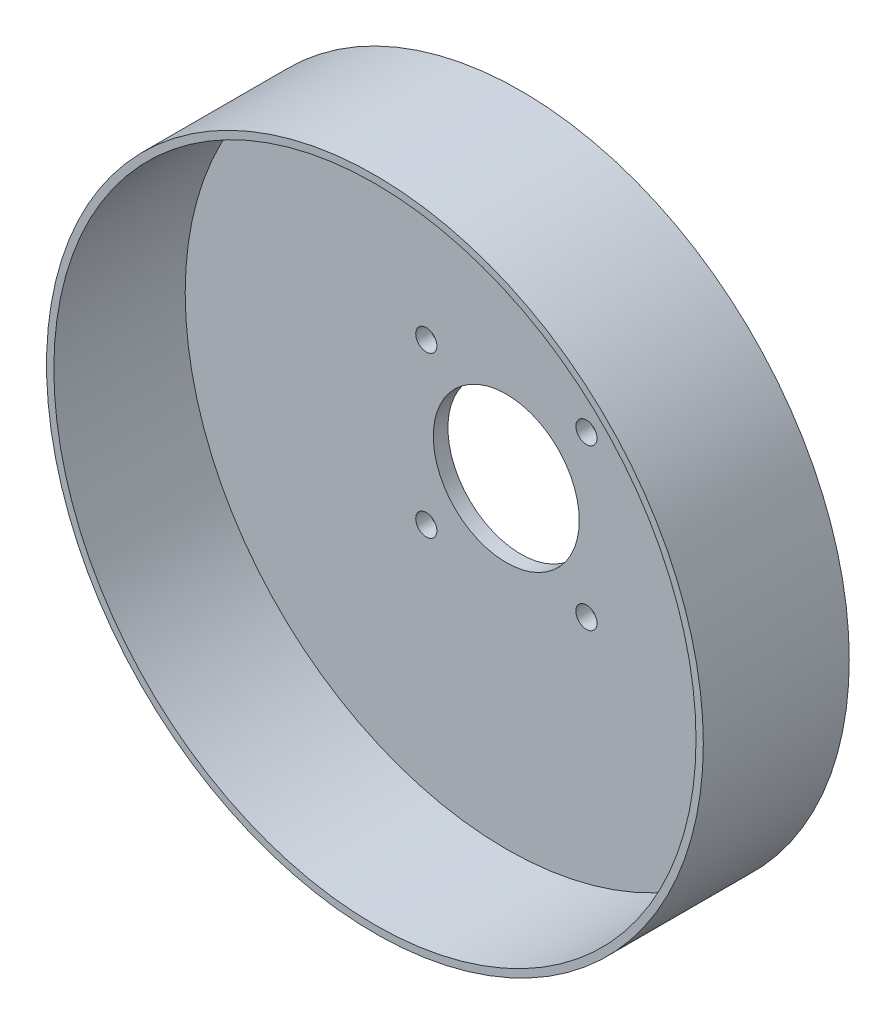
ISO-10303-21;
HEADER;
FILE_DESCRIPTION(('STEP AP214'),'2;1');
FILE_NAME('part.step','',(''),(''),'','','');
FILE_SCHEMA(('AUTOMOTIVE_DESIGN { 1 0 10303 214 1 1 1 1 }'));
ENDSEC;
DATA;
#1=APPLICATION_CONTEXT('core data for automotive mechanical design processes');
#2=APPLICATION_PROTOCOL_DEFINITION('international standard','automotive_design',2000,#1);
#3=PRODUCT_CONTEXT('',#1,'mechanical');
#4=PRODUCT('Part','Part','',(#3));
#5=PRODUCT_RELATED_PRODUCT_CATEGORY('part','',(#4));
#6=PRODUCT_DEFINITION_FORMATION('','',#4);
#7=PRODUCT_DEFINITION_CONTEXT('part definition',#1,'design');
#8=PRODUCT_DEFINITION('design','',#6,#7);
#9=PRODUCT_DEFINITION_SHAPE('','',#8);
#10=(LENGTH_UNIT() NAMED_UNIT(*) SI_UNIT(.MILLI.,.METRE.));
#11=(NAMED_UNIT(*) PLANE_ANGLE_UNIT() SI_UNIT($,.RADIAN.));
#12=(NAMED_UNIT(*) SI_UNIT($,.STERADIAN.) SOLID_ANGLE_UNIT());
#13=UNCERTAINTY_MEASURE_WITH_UNIT(LENGTH_MEASURE(1.E-05),#10,'distance_accuracy_value','');
#14=(GEOMETRIC_REPRESENTATION_CONTEXT(3) GLOBAL_UNCERTAINTY_ASSIGNED_CONTEXT((#13)) GLOBAL_UNIT_ASSIGNED_CONTEXT((#10,
#11,#12)) REPRESENTATION_CONTEXT('',''));
#15=CARTESIAN_POINT('',(0.,0.,0.));
#16=DIRECTION('',(0.,0.,1.));
#17=DIRECTION('',(1.,0.,0.));
#18=AXIS2_PLACEMENT_3D('',#15,#16,#17);
#19=CARTESIAN_POINT('',(0.,0.,-1.99999999999999));
#20=DIRECTION('',(0.,0.,1.));
#21=DIRECTION('',(1.,0.,0.));
#22=AXIS2_PLACEMENT_3D('',#19,#20,#21);
#23=PLANE('',#22);
#24=CARTESIAN_POINT('',(0.,0.,-1.99999999999999));
#25=DIRECTION('',(0.,0.,1.));
#26=DIRECTION('',(1.,0.,0.));
#27=AXIS2_PLACEMENT_3D('',#24,#25,#26);
#28=CIRCLE('',#27,10.);
#29=CARTESIAN_POINT('',(10.,0.,-1.99999999999999));
#30=VERTEX_POINT('',#29);
#31=EDGE_CURVE('E99',#30,#30,#28,.T.);
#32=ORIENTED_EDGE('',*,*,#31,.T.);
#33=EDGE_LOOP('',(#32));
#34=FACE_BOUND('',#33,.T.);
#35=CARTESIAN_POINT('',(10.9829379988893,-10.9829379988893,-1.99999999999999));
#36=DIRECTION('',(0.,0.,-1.));
#37=DIRECTION('',(-1.,0.,0.));
#38=AXIS2_PLACEMENT_3D('',#35,#36,#37);
#39=CIRCLE('',#38,1.45);
#40=CARTESIAN_POINT('',(9.53293799888926,-10.9829379988893,-1.99999999999999));
#41=VERTEX_POINT('',#40);
#42=EDGE_CURVE('E87',#41,#41,#39,.T.);
#43=ORIENTED_EDGE('',*,*,#42,.F.);
#44=EDGE_LOOP('',(#43));
#45=FACE_BOUND('',#44,.T.);
#46=CARTESIAN_POINT('',(10.9829379988893,10.9601551083914,-1.99999999999999));
#47=DIRECTION('',(0.,0.,-1.));
#48=DIRECTION('',(-1.,0.,0.));
#49=AXIS2_PLACEMENT_3D('',#46,#47,#48);
#50=CIRCLE('',#49,1.45);
#51=CARTESIAN_POINT('',(9.53293799888935,10.9601551083914,-1.99999999999999));
#52=VERTEX_POINT('',#51);
#53=EDGE_CURVE('E77',#52,#52,#50,.T.);
#54=ORIENTED_EDGE('',*,*,#53,.F.);
#55=EDGE_LOOP('',(#54));
#56=FACE_BOUND('',#55,.T.);
#57=CARTESIAN_POINT('',(-10.9601551083915,10.9601551083915,-1.99999999999999));
#58=DIRECTION('',(0.,0.,-1.));
#59=DIRECTION('',(-1.,0.,0.));
#60=AXIS2_PLACEMENT_3D('',#57,#58,#59);
#61=CIRCLE('',#60,1.45);
#62=CARTESIAN_POINT('',(-12.4101551083915,10.9601551083915,-1.99999999999999));
#63=VERTEX_POINT('',#62);
#64=EDGE_CURVE('E63',#63,#63,#61,.T.);
#65=ORIENTED_EDGE('',*,*,#64,.F.);
#66=EDGE_LOOP('',(#65));
#67=FACE_BOUND('',#66,.T.);
#68=CARTESIAN_POINT('',(0.,0.,-1.99999999999999));
#69=DIRECTION('',(0.,0.,1.));
#70=DIRECTION('',(1.,0.,0.));
#71=AXIS2_PLACEMENT_3D('',#68,#69,#70);
#72=CIRCLE('',#71,45.);
#73=CARTESIAN_POINT('',(45.,0.,-1.99999999999999));
#74=VERTEX_POINT('',#73);
#75=EDGE_CURVE('E62',#74,#74,#72,.T.);
#76=ORIENTED_EDGE('',*,*,#75,.F.);
#77=EDGE_LOOP('',(#76));
#78=FACE_BOUND('',#77,.T.);
#79=CARTESIAN_POINT('',(-10.9601551083916,-10.9829379988892,-1.99999999999999));
#80=DIRECTION('',(0.,0.,-1.));
#81=DIRECTION('',(-1.,0.,0.));
#82=AXIS2_PLACEMENT_3D('',#79,#80,#81);
#83=CIRCLE('',#82,1.45);
#84=CARTESIAN_POINT('',(-12.4101551083916,-10.9829379988892,-1.99999999999999));
#85=VERTEX_POINT('',#84);
#86=EDGE_CURVE('E95',#85,#85,#83,.T.);
#87=ORIENTED_EDGE('',*,*,#86,.F.);
#88=EDGE_LOOP('',(#87));
#89=FACE_BOUND('',#88,.T.);
#90=ADVANCED_FACE('F41',(#34,#45,#56,#67,#78,#89),#23,.F.);
#91=CARTESIAN_POINT('',(0.,0.,18.));
#92=DIRECTION('',(0.,0.,1.));
#93=DIRECTION('',(1.,0.,0.));
#94=AXIS2_PLACEMENT_3D('',#91,#92,#93);
#95=PLANE('',#94);
#96=CARTESIAN_POINT('',(0.,0.,18.));
#97=DIRECTION('',(0.,0.,1.));
#98=DIRECTION('',(1.,0.,0.));
#99=AXIS2_PLACEMENT_3D('',#96,#97,#98);
#100=CIRCLE('',#99,45.);
#101=CARTESIAN_POINT('',(45.,0.,18.));
#102=VERTEX_POINT('',#101);
#103=EDGE_CURVE('E10',#102,#102,#100,.T.);
#104=ORIENTED_EDGE('',*,*,#103,.T.);
#105=EDGE_LOOP('',(#104));
#106=FACE_BOUND('',#105,.T.);
#107=CARTESIAN_POINT('',(0.,0.,18.));
#108=DIRECTION('',(0.,0.,1.));
#109=DIRECTION('',(1.,0.,0.));
#110=AXIS2_PLACEMENT_3D('',#107,#108,#109);
#111=CIRCLE('',#110,44.);
#112=CARTESIAN_POINT('',(44.,0.,18.));
#113=VERTEX_POINT('',#112);
#114=EDGE_CURVE('E50',#113,#113,#111,.T.);
#115=ORIENTED_EDGE('',*,*,#114,.F.);
#116=EDGE_LOOP('',(#115));
#117=FACE_BOUND('',#116,.T.);
#118=ADVANCED_FACE('F134',(#106,#117),#95,.T.);
#119=CARTESIAN_POINT('',(0.,0.,18.));
#120=DIRECTION('',(0.,0.,-1.));
#121=DIRECTION('',(-1.,0.,0.));
#122=AXIS2_PLACEMENT_3D('',#119,#120,#121);
#123=CYLINDRICAL_SURFACE('',#122,45.);
#124=ORIENTED_EDGE('',*,*,#103,.F.);
#125=EDGE_LOOP('',(#124));
#126=FACE_BOUND('',#125,.T.);
#127=ORIENTED_EDGE('',*,*,#75,.T.);
#128=EDGE_LOOP('',(#127));
#129=FACE_BOUND('',#128,.T.);
#130=ADVANCED_FACE('F43',(#126,#129),#123,.T.);
#131=CARTESIAN_POINT('',(0.,0.,18.));
#132=DIRECTION('',(0.,0.,-1.));
#133=DIRECTION('',(-1.,0.,0.));
#134=AXIS2_PLACEMENT_3D('',#131,#132,#133);
#135=CYLINDRICAL_SURFACE('',#134,44.);
#136=ORIENTED_EDGE('',*,*,#114,.T.);
#137=EDGE_LOOP('',(#136));
#138=FACE_BOUND('',#137,.T.);
#139=CARTESIAN_POINT('',(0.,0.,0.));
#140=DIRECTION('',(0.,0.,1.));
#141=DIRECTION('',(1.,0.,0.));
#142=AXIS2_PLACEMENT_3D('',#139,#140,#141);
#143=CIRCLE('',#142,44.);
#144=CARTESIAN_POINT('',(44.,0.,0.));
#145=VERTEX_POINT('',#144);
#146=EDGE_CURVE('E56',#145,#145,#143,.T.);
#147=ORIENTED_EDGE('',*,*,#146,.F.);
#148=EDGE_LOOP('',(#147));
#149=FACE_BOUND('',#148,.T.);
#150=ADVANCED_FACE('F115',(#138,#149),#135,.F.);
#151=CARTESIAN_POINT('',(0.,0.,0.));
#152=DIRECTION('',(0.,0.,1.));
#153=DIRECTION('',(1.,0.,0.));
#154=AXIS2_PLACEMENT_3D('',#151,#152,#153);
#155=PLANE('',#154);
#156=CARTESIAN_POINT('',(0.,0.,0.));
#157=DIRECTION('',(0.,0.,1.));
#158=DIRECTION('',(1.,0.,0.));
#159=AXIS2_PLACEMENT_3D('',#156,#157,#158);
#160=CIRCLE('',#159,10.);
#161=CARTESIAN_POINT('',(10.,0.,0.));
#162=VERTEX_POINT('',#161);
#163=EDGE_CURVE('E45',#162,#162,#160,.T.);
#164=ORIENTED_EDGE('',*,*,#163,.F.);
#165=EDGE_LOOP('',(#164));
#166=FACE_BOUND('',#165,.T.);
#167=CARTESIAN_POINT('',(-10.9601551083916,-10.9829379988892,0.));
#168=DIRECTION('',(0.,0.,1.));
#169=DIRECTION('',(1.,0.,0.));
#170=AXIS2_PLACEMENT_3D('',#167,#168,#169);
#171=CIRCLE('',#170,1.45);
#172=CARTESIAN_POINT('',(-9.51015510839163,-10.9829379988892,0.));
#173=VERTEX_POINT('',#172);
#174=EDGE_CURVE('E91',#173,#173,#171,.T.);
#175=ORIENTED_EDGE('',*,*,#174,.F.);
#176=EDGE_LOOP('',(#175));
#177=FACE_BOUND('',#176,.T.);
#178=CARTESIAN_POINT('',(10.9829379988893,-10.9829379988893,0.));
#179=DIRECTION('',(0.,0.,1.));
#180=DIRECTION('',(1.,0.,0.));
#181=AXIS2_PLACEMENT_3D('',#178,#179,#180);
#182=CIRCLE('',#181,1.45);
#183=CARTESIAN_POINT('',(12.4329379988893,-10.9829379988893,0.));
#184=VERTEX_POINT('',#183);
#185=EDGE_CURVE('E83',#184,#184,#182,.T.);
#186=ORIENTED_EDGE('',*,*,#185,.F.);
#187=EDGE_LOOP('',(#186));
#188=FACE_BOUND('',#187,.T.);
#189=CARTESIAN_POINT('',(10.9829379988893,10.9601551083914,0.));
#190=DIRECTION('',(0.,0.,1.));
#191=DIRECTION('',(1.,0.,0.));
#192=AXIS2_PLACEMENT_3D('',#189,#190,#191);
#193=CIRCLE('',#192,1.45);
#194=CARTESIAN_POINT('',(12.4329379988893,10.9601551083914,0.));
#195=VERTEX_POINT('',#194);
#196=EDGE_CURVE('E71',#195,#195,#193,.T.);
#197=ORIENTED_EDGE('',*,*,#196,.F.);
#198=EDGE_LOOP('',(#197));
#199=FACE_BOUND('',#198,.T.);
#200=CARTESIAN_POINT('',(-10.9601551083915,10.9601551083915,0.));
#201=DIRECTION('',(0.,0.,1.));
#202=DIRECTION('',(1.,0.,0.));
#203=AXIS2_PLACEMENT_3D('',#200,#201,#202);
#204=CIRCLE('',#203,1.45);
#205=CARTESIAN_POINT('',(-9.51015510839147,10.9601551083915,0.));
#206=VERTEX_POINT('',#205);
#207=EDGE_CURVE('E59',#206,#206,#204,.T.);
#208=ORIENTED_EDGE('',*,*,#207,.F.);
#209=EDGE_LOOP('',(#208));
#210=FACE_BOUND('',#209,.T.);
#211=ORIENTED_EDGE('',*,*,#146,.T.);
#212=EDGE_LOOP('',(#211));
#213=FACE_BOUND('',#212,.T.);
#214=ADVANCED_FACE('F111',(#166,#177,#188,#199,#210,#213),#155,.T.);
#215=CARTESIAN_POINT('',(-10.9601551083915,10.9601551083915,-1.99999999999999));
#216=DIRECTION('',(0.,0.,-1.));
#217=DIRECTION('',(-1.,0.,0.));
#218=AXIS2_PLACEMENT_3D('',#215,#216,#217);
#219=CYLINDRICAL_SURFACE('',#218,1.45);
#220=ORIENTED_EDGE('',*,*,#207,.T.);
#221=EDGE_LOOP('',(#220));
#222=FACE_BOUND('',#221,.T.);
#223=ORIENTED_EDGE('',*,*,#64,.T.);
#224=EDGE_LOOP('',(#223));
#225=FACE_BOUND('',#224,.T.);
#226=ADVANCED_FACE('F114',(#222,#225),#219,.F.);
#227=CARTESIAN_POINT('',(10.9829379988893,10.9601551083914,-1.99999999999999));
#228=DIRECTION('',(0.,0.,-1.));
#229=DIRECTION('',(-1.,0.,0.));
#230=AXIS2_PLACEMENT_3D('',#227,#228,#229);
#231=CYLINDRICAL_SURFACE('',#230,1.45);
#232=ORIENTED_EDGE('',*,*,#196,.T.);
#233=EDGE_LOOP('',(#232));
#234=FACE_BOUND('',#233,.T.);
#235=ORIENTED_EDGE('',*,*,#53,.T.);
#236=EDGE_LOOP('',(#235));
#237=FACE_BOUND('',#236,.T.);
#238=ADVANCED_FACE('F145',(#234,#237),#231,.F.);
#239=CARTESIAN_POINT('',(10.9829379988893,-10.9829379988893,-1.99999999999999));
#240=DIRECTION('',(0.,0.,-1.));
#241=DIRECTION('',(-1.,0.,0.));
#242=AXIS2_PLACEMENT_3D('',#239,#240,#241);
#243=CYLINDRICAL_SURFACE('',#242,1.45);
#244=ORIENTED_EDGE('',*,*,#185,.T.);
#245=EDGE_LOOP('',(#244));
#246=FACE_BOUND('',#245,.T.);
#247=ORIENTED_EDGE('',*,*,#42,.T.);
#248=EDGE_LOOP('',(#247));
#249=FACE_BOUND('',#248,.T.);
#250=ADVANCED_FACE('F148',(#246,#249),#243,.F.);
#251=CARTESIAN_POINT('',(-10.9601551083916,-10.9829379988892,-1.99999999999999));
#252=DIRECTION('',(0.,0.,-1.));
#253=DIRECTION('',(-1.,0.,0.));
#254=AXIS2_PLACEMENT_3D('',#251,#252,#253);
#255=CYLINDRICAL_SURFACE('',#254,1.45);
#256=ORIENTED_EDGE('',*,*,#174,.T.);
#257=EDGE_LOOP('',(#256));
#258=FACE_BOUND('',#257,.T.);
#259=ORIENTED_EDGE('',*,*,#86,.T.);
#260=EDGE_LOOP('',(#259));
#261=FACE_BOUND('',#260,.T.);
#262=ADVANCED_FACE('F152',(#258,#261),#255,.F.);
#263=CARTESIAN_POINT('',(0.,0.,18.));
#264=DIRECTION('',(0.,0.,-1.));
#265=DIRECTION('',(-1.,0.,0.));
#266=AXIS2_PLACEMENT_3D('',#263,#264,#265);
#267=CYLINDRICAL_SURFACE('',#266,10.);
#268=ORIENTED_EDGE('',*,*,#163,.T.);
#269=EDGE_LOOP('',(#268));
#270=FACE_BOUND('',#269,.T.);
#271=ORIENTED_EDGE('',*,*,#31,.F.);
#272=EDGE_LOOP('',(#271));
#273=FACE_BOUND('',#272,.T.);
#274=ADVANCED_FACE('F108',(#270,#273),#267,.F.);
#275=CLOSED_SHELL('',(#90,#118,#130,#150,#214,#226,#238,#250,#262,#274));
#276=MANIFOLD_SOLID_BREP('B2',#275);
#277=ADVANCED_BREP_SHAPE_REPRESENTATION('',(#18,#276),#14);
#278=SHAPE_DEFINITION_REPRESENTATION(#9,#277);
ENDSEC;
END-ISO-10303-21;
